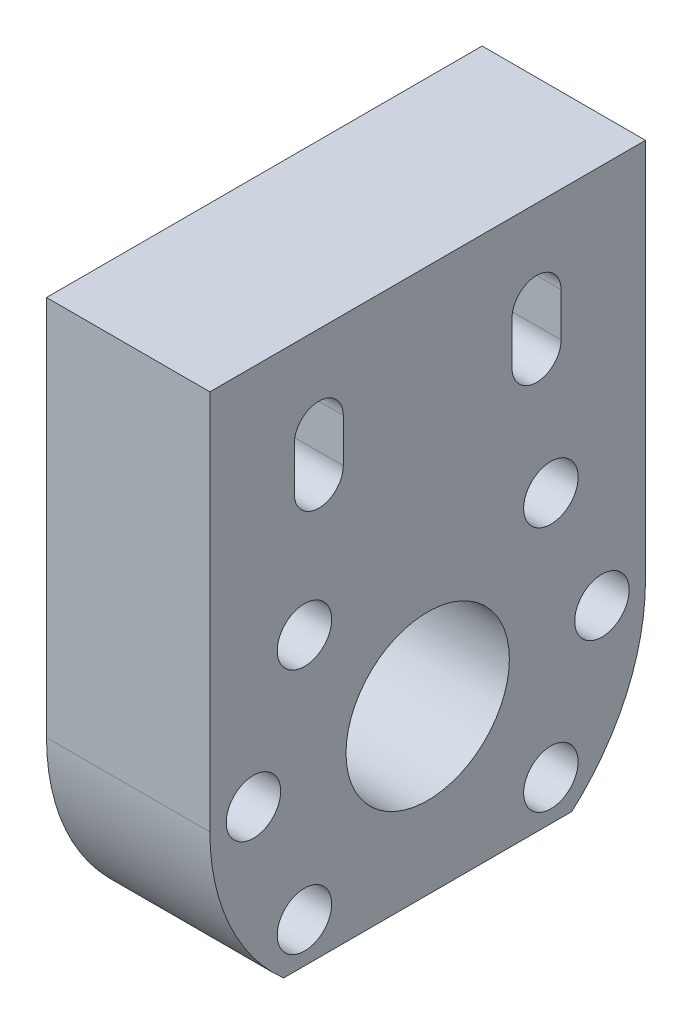
ISO-10303-21;
HEADER;
FILE_DESCRIPTION(('STEP AP214'),'2;1');
FILE_NAME('part.step','',(''),(''),'','','');
FILE_SCHEMA(('AUTOMOTIVE_DESIGN { 1 0 10303 214 1 1 1 1 }'));
ENDSEC;
DATA;
#1=APPLICATION_CONTEXT('core data for automotive mechanical design processes');
#2=APPLICATION_PROTOCOL_DEFINITION('international standard','automotive_design',2000,#1);
#3=PRODUCT_CONTEXT('',#1,'mechanical');
#4=PRODUCT('Part','Part','',(#3));
#5=PRODUCT_RELATED_PRODUCT_CATEGORY('part','',(#4));
#6=PRODUCT_DEFINITION_FORMATION('','',#4);
#7=PRODUCT_DEFINITION_CONTEXT('part definition',#1,'design');
#8=PRODUCT_DEFINITION('design','',#6,#7);
#9=PRODUCT_DEFINITION_SHAPE('','',#8);
#10=(LENGTH_UNIT() NAMED_UNIT(*) SI_UNIT(.MILLI.,.METRE.));
#11=(NAMED_UNIT(*) PLANE_ANGLE_UNIT() SI_UNIT($,.RADIAN.));
#12=(NAMED_UNIT(*) SI_UNIT($,.STERADIAN.) SOLID_ANGLE_UNIT());
#13=UNCERTAINTY_MEASURE_WITH_UNIT(LENGTH_MEASURE(1.E-05),#10,'distance_accuracy_value','');
#14=(GEOMETRIC_REPRESENTATION_CONTEXT(3) GLOBAL_UNCERTAINTY_ASSIGNED_CONTEXT((#13)) GLOBAL_UNIT_ASSIGNED_CONTEXT((#10,
#11,#12)) REPRESENTATION_CONTEXT('',''));
#15=CARTESIAN_POINT('',(0.,0.,0.));
#16=DIRECTION('',(0.,0.,1.));
#17=DIRECTION('',(1.,0.,0.));
#18=AXIS2_PLACEMENT_3D('',#15,#16,#17);
#19=CARTESIAN_POINT('',(15.,0.,0.));
#20=DIRECTION('',(-1.,0.,0.));
#21=DIRECTION('',(0.,0.,1.));
#22=AXIS2_PLACEMENT_3D('',#19,#20,#21);
#23=PLANE('',#22);
#24=CARTESIAN_POINT('',(15.,11.3137084989846,-11.3137084989849));
#25=DIRECTION('',(1.,0.,0.));
#26=DIRECTION('',(0.,0.,-1.));
#27=AXIS2_PLACEMENT_3D('',#24,#25,#26);
#28=CIRCLE('',#27,2.5);
#29=CARTESIAN_POINT('',(15.,11.3137084989846,-13.8137084989849));
#30=VERTEX_POINT('',#29);
#31=EDGE_CURVE('E174',#30,#30,#28,.T.);
#32=ORIENTED_EDGE('',*,*,#31,.F.);
#33=EDGE_LOOP('',(#32));
#34=FACE_BOUND('',#33,.T.);
#35=CARTESIAN_POINT('',(15.,11.3137084989849,11.3137084989847));
#36=DIRECTION('',(1.,0.,0.));
#37=DIRECTION('',(0.,0.,-1.));
#38=AXIS2_PLACEMENT_3D('',#35,#36,#37);
#39=CIRCLE('',#38,2.5);
#40=CARTESIAN_POINT('',(15.,11.3137084989849,8.81370849898466));
#41=VERTEX_POINT('',#40);
#42=EDGE_CURVE('E180',#41,#41,#39,.T.);
#43=ORIENTED_EDGE('',*,*,#42,.F.);
#44=EDGE_LOOP('',(#43));
#45=FACE_BOUND('',#44,.T.);
#46=CARTESIAN_POINT('',(15.,1.1172740284298E-13,16.));
#47=DIRECTION('',(1.,0.,0.));
#48=DIRECTION('',(0.,0.,-1.));
#49=AXIS2_PLACEMENT_3D('',#46,#47,#48);
#50=CIRCLE('',#49,2.5);
#51=CARTESIAN_POINT('',(15.,1.1172740284298E-13,13.5));
#52=VERTEX_POINT('',#51);
#53=EDGE_CURVE('E186',#52,#52,#50,.T.);
#54=ORIENTED_EDGE('',*,*,#53,.F.);
#55=EDGE_LOOP('',(#54));
#56=FACE_BOUND('',#55,.T.);
#57=CARTESIAN_POINT('',(15.,-11.3137084989847,11.3137084989848));
#58=DIRECTION('',(1.,0.,0.));
#59=DIRECTION('',(0.,0.,-1.));
#60=AXIS2_PLACEMENT_3D('',#57,#58,#59);
#61=CIRCLE('',#60,2.5);
#62=CARTESIAN_POINT('',(15.,-11.3137084989847,8.81370849898482));
#63=VERTEX_POINT('',#62);
#64=EDGE_CURVE('E192',#63,#63,#61,.T.);
#65=ORIENTED_EDGE('',*,*,#64,.F.);
#66=EDGE_LOOP('',(#65));
#67=FACE_BOUND('',#66,.T.);
#68=CARTESIAN_POINT('',(15.,27.,10.));
#69=DIRECTION('',(1.,0.,0.));
#70=DIRECTION('',(0.,0.,1.));
#71=AXIS2_PLACEMENT_3D('',#68,#69,#70);
#72=CIRCLE('',#71,2.25);
#73=CARTESIAN_POINT('',(15.,27.,7.75));
#74=VERTEX_POINT('',#73);
#75=CARTESIAN_POINT('',(15.,27.,12.25));
#76=VERTEX_POINT('',#75);
#77=EDGE_CURVE('E198',#74,#76,#72,.T.);
#78=ORIENTED_EDGE('',*,*,#77,.F.);
#79=DIRECTION('',(0.,1.,0.));
#80=VECTOR('',#79,1.);
#81=CARTESIAN_POINT('',(15.,23.,7.75));
#82=LINE('',#81,#80);
#83=CARTESIAN_POINT('',(15.,23.,7.75));
#84=VERTEX_POINT('',#83);
#85=EDGE_CURVE('E206',#84,#74,#82,.T.);
#86=ORIENTED_EDGE('',*,*,#85,.F.);
#87=CARTESIAN_POINT('',(15.,23.,10.));
#88=DIRECTION('',(1.,0.,0.));
#89=DIRECTION('',(0.,0.,1.));
#90=AXIS2_PLACEMENT_3D('',#87,#88,#89);
#91=CIRCLE('',#90,2.25);
#92=CARTESIAN_POINT('',(15.,23.,12.25));
#93=VERTEX_POINT('',#92);
#94=EDGE_CURVE('E203',#93,#84,#91,.T.);
#95=ORIENTED_EDGE('',*,*,#94,.F.);
#96=DIRECTION('',(0.,-1.,0.));
#97=VECTOR('',#96,1.);
#98=CARTESIAN_POINT('',(15.,23.,12.25));
#99=LINE('',#98,#97);
#100=EDGE_CURVE('E200',#76,#93,#99,.T.);
#101=ORIENTED_EDGE('',*,*,#100,.F.);
#102=EDGE_LOOP('',(#78,#86,#95,#101));
#103=FACE_BOUND('',#102,.T.);
#104=CARTESIAN_POINT('',(15.,0.,0.));
#105=DIRECTION('',(1.,0.,0.));
#106=DIRECTION('',(0.,0.,1.));
#107=AXIS2_PLACEMENT_3D('',#104,#105,#106);
#108=CIRCLE('',#107,20.);
#109=CARTESIAN_POINT('',(15.,1.4210854715202E-13,20.));
#110=VERTEX_POINT('',#109);
#111=CARTESIAN_POINT('',(15.,-15.,13.228756555323));
#112=VERTEX_POINT('',#111);
#113=EDGE_CURVE('E247',#110,#112,#108,.T.);
#114=ORIENTED_EDGE('',*,*,#113,.T.);
#115=DIRECTION('',(0.,0.,-1.));
#116=VECTOR('',#115,1.);
#117=CARTESIAN_POINT('',(15.,-15.,13.228756555323));
#118=LINE('',#117,#116);
#119=CARTESIAN_POINT('',(15.,-15.,-13.228756555323));
#120=VERTEX_POINT('',#119);
#121=EDGE_CURVE('E250',#112,#120,#118,.T.);
#122=ORIENTED_EDGE('',*,*,#121,.T.);
#123=CARTESIAN_POINT('',(15.,0.,0.));
#124=DIRECTION('',(1.,0.,0.));
#125=DIRECTION('',(0.,0.,1.));
#126=AXIS2_PLACEMENT_3D('',#123,#124,#125);
#127=CIRCLE('',#126,20.);
#128=CARTESIAN_POINT('',(15.,1.4210854715202E-13,-20.));
#129=VERTEX_POINT('',#128);
#130=EDGE_CURVE('E253',#120,#129,#127,.T.);
#131=ORIENTED_EDGE('',*,*,#130,.T.);
#132=DIRECTION('',(0.,1.,0.));
#133=VECTOR('',#132,1.);
#134=CARTESIAN_POINT('',(15.,1.4210854715202E-13,-20.));
#135=LINE('',#134,#133);
#136=CARTESIAN_POINT('',(15.,35.,-20.));
#137=VERTEX_POINT('',#136);
#138=EDGE_CURVE('E255',#129,#137,#135,.T.);
#139=ORIENTED_EDGE('',*,*,#138,.T.);
#140=DIRECTION('',(0.,0.,1.));
#141=VECTOR('',#140,1.);
#142=CARTESIAN_POINT('',(15.,35.,20.));
#143=LINE('',#142,#141);
#144=CARTESIAN_POINT('',(15.,35.,20.));
#145=VERTEX_POINT('',#144);
#146=EDGE_CURVE('E257',#137,#145,#143,.T.);
#147=ORIENTED_EDGE('',*,*,#146,.T.);
#148=DIRECTION('',(0.,-1.,0.));
#149=VECTOR('',#148,1.);
#150=CARTESIAN_POINT('',(15.,1.4210854715202E-13,20.));
#151=LINE('',#150,#149);
#152=EDGE_CURVE('E259',#145,#110,#151,.T.);
#153=ORIENTED_EDGE('',*,*,#152,.T.);
#154=EDGE_LOOP('',(#114,#122,#131,#139,#147,#153));
#155=FACE_BOUND('',#154,.T.);
#156=CARTESIAN_POINT('',(15.,0.,0.));
#157=DIRECTION('',(1.,0.,0.));
#158=DIRECTION('',(0.,0.,-1.));
#159=AXIS2_PLACEMENT_3D('',#156,#157,#158);
#160=CIRCLE('',#159,7.5);
#161=CARTESIAN_POINT('',(15.,0.,-7.5));
#162=VERTEX_POINT('',#161);
#163=EDGE_CURVE('E241',#162,#162,#160,.T.);
#164=ORIENTED_EDGE('',*,*,#163,.F.);
#165=EDGE_LOOP('',(#164));
#166=FACE_BOUND('',#165,.T.);
#167=CARTESIAN_POINT('',(15.,0.,-16.));
#168=DIRECTION('',(1.,0.,0.));
#169=DIRECTION('',(0.,0.,-1.));
#170=AXIS2_PLACEMENT_3D('',#167,#168,#169);
#171=CIRCLE('',#170,2.5);
#172=CARTESIAN_POINT('',(15.,0.,-18.5));
#173=VERTEX_POINT('',#172);
#174=EDGE_CURVE('E235',#173,#173,#171,.T.);
#175=ORIENTED_EDGE('',*,*,#174,.F.);
#176=EDGE_LOOP('',(#175));
#177=FACE_BOUND('',#176,.T.);
#178=CARTESIAN_POINT('',(15.,-11.3137084989848,-11.3137084989847));
#179=DIRECTION('',(1.,0.,0.));
#180=DIRECTION('',(0.,0.,-1.));
#181=AXIS2_PLACEMENT_3D('',#178,#179,#180);
#182=CIRCLE('',#181,2.5);
#183=CARTESIAN_POINT('',(15.,-11.3137084989848,-13.8137084989847));
#184=VERTEX_POINT('',#183);
#185=EDGE_CURVE('E229',#184,#184,#182,.T.);
#186=ORIENTED_EDGE('',*,*,#185,.F.);
#187=EDGE_LOOP('',(#186));
#188=FACE_BOUND('',#187,.T.);
#189=CARTESIAN_POINT('',(15.,27.,-10.));
#190=DIRECTION('',(1.,0.,0.));
#191=DIRECTION('',(0.,0.,-1.));
#192=AXIS2_PLACEMENT_3D('',#189,#190,#191);
#193=CIRCLE('',#192,2.25);
#194=CARTESIAN_POINT('',(15.,27.,-12.25));
#195=VERTEX_POINT('',#194);
#196=CARTESIAN_POINT('',(15.,27.,-7.75));
#197=VERTEX_POINT('',#196);
#198=EDGE_CURVE('E138',#195,#197,#193,.T.);
#199=ORIENTED_EDGE('',*,*,#198,.F.);
#200=DIRECTION('',(0.,1.,0.));
#201=VECTOR('',#200,1.);
#202=CARTESIAN_POINT('',(15.,23.,-12.25));
#203=LINE('',#202,#201);
#204=CARTESIAN_POINT('',(15.,23.,-12.25));
#205=VERTEX_POINT('',#204);
#206=EDGE_CURVE('E160',#205,#195,#203,.T.);
#207=ORIENTED_EDGE('',*,*,#206,.F.);
#208=CARTESIAN_POINT('',(15.,23.,-10.));
#209=DIRECTION('',(1.,0.,0.));
#210=DIRECTION('',(0.,0.,-1.));
#211=AXIS2_PLACEMENT_3D('',#208,#209,#210);
#212=CIRCLE('',#211,2.25);
#213=CARTESIAN_POINT('',(15.,23.,-7.75));
#214=VERTEX_POINT('',#213);
#215=EDGE_CURVE('E158',#214,#205,#212,.T.);
#216=ORIENTED_EDGE('',*,*,#215,.F.);
#217=DIRECTION('',(0.,-1.,0.));
#218=VECTOR('',#217,1.);
#219=CARTESIAN_POINT('',(15.,23.,-7.75));
#220=LINE('',#219,#218);
#221=EDGE_CURVE('E146',#197,#214,#220,.T.);
#222=ORIENTED_EDGE('',*,*,#221,.F.);
#223=EDGE_LOOP('',(#199,#207,#216,#222));
#224=FACE_BOUND('',#223,.T.);
#225=ADVANCED_FACE('F37',(#34,#45,#56,#67,#103,#155,#166,#177,#188,#224),#23,.F.);
#226=CARTESIAN_POINT('',(0.,0.,0.));
#227=DIRECTION('',(-1.,0.,0.));
#228=DIRECTION('',(0.,0.,1.));
#229=AXIS2_PLACEMENT_3D('',#226,#227,#228);
#230=PLANE('',#229);
#231=CARTESIAN_POINT('',(0.,11.3137084989849,11.3137084989847));
#232=DIRECTION('',(1.,0.,0.));
#233=DIRECTION('',(0.,0.,-1.));
#234=AXIS2_PLACEMENT_3D('',#231,#232,#233);
#235=CIRCLE('',#234,2.5);
#236=CARTESIAN_POINT('',(0.,11.3137084989849,8.81370849898466));
#237=VERTEX_POINT('',#236);
#238=EDGE_CURVE('E177',#237,#237,#235,.T.);
#239=ORIENTED_EDGE('',*,*,#238,.T.);
#240=EDGE_LOOP('',(#239));
#241=FACE_BOUND('',#240,.T.);
#242=CARTESIAN_POINT('',(0.,-11.3137084989847,11.3137084989848));
#243=DIRECTION('',(1.,0.,0.));
#244=DIRECTION('',(0.,0.,-1.));
#245=AXIS2_PLACEMENT_3D('',#242,#243,#244);
#246=CIRCLE('',#245,2.5);
#247=CARTESIAN_POINT('',(0.,-11.3137084989847,8.81370849898482));
#248=VERTEX_POINT('',#247);
#249=EDGE_CURVE('E189',#248,#248,#246,.T.);
#250=ORIENTED_EDGE('',*,*,#249,.T.);
#251=EDGE_LOOP('',(#250));
#252=FACE_BOUND('',#251,.T.);
#253=CARTESIAN_POINT('',(0.,0.,-16.));
#254=DIRECTION('',(1.,0.,0.));
#255=DIRECTION('',(0.,0.,-1.));
#256=AXIS2_PLACEMENT_3D('',#253,#254,#255);
#257=CIRCLE('',#256,2.5);
#258=CARTESIAN_POINT('',(0.,0.,-18.5));
#259=VERTEX_POINT('',#258);
#260=EDGE_CURVE('E232',#259,#259,#257,.T.);
#261=ORIENTED_EDGE('',*,*,#260,.T.);
#262=EDGE_LOOP('',(#261));
#263=FACE_BOUND('',#262,.T.);
#264=CARTESIAN_POINT('',(0.,0.,0.));
#265=DIRECTION('',(1.,0.,0.));
#266=DIRECTION('',(0.,0.,1.));
#267=AXIS2_PLACEMENT_3D('',#264,#265,#266);
#268=CIRCLE('',#267,20.);
#269=CARTESIAN_POINT('',(0.,1.4210854715202E-13,20.));
#270=VERTEX_POINT('',#269);
#271=CARTESIAN_POINT('',(0.,-15.,13.228756555323));
#272=VERTEX_POINT('',#271);
#273=EDGE_CURVE('E244',#270,#272,#268,.T.);
#274=ORIENTED_EDGE('',*,*,#273,.F.);
#275=DIRECTION('',(0.,-1.,0.));
#276=VECTOR('',#275,1.);
#277=CARTESIAN_POINT('',(0.,1.4210854715202E-13,20.));
#278=LINE('',#277,#276);
#279=CARTESIAN_POINT('',(0.,35.,20.));
#280=VERTEX_POINT('',#279);
#281=EDGE_CURVE('E251',#280,#270,#278,.T.);
#282=ORIENTED_EDGE('',*,*,#281,.F.);
#283=DIRECTION('',(0.,0.,1.));
#284=VECTOR('',#283,1.);
#285=CARTESIAN_POINT('',(0.,35.,20.));
#286=LINE('',#285,#284);
#287=CARTESIAN_POINT('',(0.,35.,-20.));
#288=VERTEX_POINT('',#287);
#289=EDGE_CURVE('E270',#288,#280,#286,.T.);
#290=ORIENTED_EDGE('',*,*,#289,.F.);
#291=DIRECTION('',(0.,1.,0.));
#292=VECTOR('',#291,1.);
#293=CARTESIAN_POINT('',(0.,1.4210854715202E-13,-20.));
#294=LINE('',#293,#292);
#295=CARTESIAN_POINT('',(0.,1.4210854715202E-13,-20.));
#296=VERTEX_POINT('',#295);
#297=EDGE_CURVE('E268',#296,#288,#294,.T.);
#298=ORIENTED_EDGE('',*,*,#297,.F.);
#299=CARTESIAN_POINT('',(0.,0.,0.));
#300=DIRECTION('',(1.,0.,0.));
#301=DIRECTION('',(0.,0.,1.));
#302=AXIS2_PLACEMENT_3D('',#299,#300,#301);
#303=CIRCLE('',#302,20.);
#304=CARTESIAN_POINT('',(0.,-15.,-13.228756555323));
#305=VERTEX_POINT('',#304);
#306=EDGE_CURVE('E266',#305,#296,#303,.T.);
#307=ORIENTED_EDGE('',*,*,#306,.F.);
#308=DIRECTION('',(0.,0.,-1.));
#309=VECTOR('',#308,1.);
#310=CARTESIAN_POINT('',(0.,-15.,13.228756555323));
#311=LINE('',#310,#309);
#312=EDGE_CURVE('E264',#272,#305,#311,.T.);
#313=ORIENTED_EDGE('',*,*,#312,.F.);
#314=EDGE_LOOP('',(#274,#282,#290,#298,#307,#313));
#315=FACE_BOUND('',#314,.T.);
#316=CARTESIAN_POINT('',(0.,0.,0.));
#317=DIRECTION('',(1.,0.,0.));
#318=DIRECTION('',(0.,0.,-1.));
#319=AXIS2_PLACEMENT_3D('',#316,#317,#318);
#320=CIRCLE('',#319,7.5);
#321=CARTESIAN_POINT('',(0.,0.,-7.5));
#322=VERTEX_POINT('',#321);
#323=EDGE_CURVE('E238',#322,#322,#320,.T.);
#324=ORIENTED_EDGE('',*,*,#323,.T.);
#325=EDGE_LOOP('',(#324));
#326=FACE_BOUND('',#325,.T.);
#327=CARTESIAN_POINT('',(0.,-11.3137084989848,-11.3137084989847));
#328=DIRECTION('',(1.,0.,0.));
#329=DIRECTION('',(0.,0.,-1.));
#330=AXIS2_PLACEMENT_3D('',#327,#328,#329);
#331=CIRCLE('',#330,2.5);
#332=CARTESIAN_POINT('',(0.,-11.3137084989848,-13.8137084989847));
#333=VERTEX_POINT('',#332);
#334=EDGE_CURVE('E228',#333,#333,#331,.T.);
#335=ORIENTED_EDGE('',*,*,#334,.T.);
#336=EDGE_LOOP('',(#335));
#337=FACE_BOUND('',#336,.T.);
#338=DIRECTION('',(0.,1.,0.));
#339=VECTOR('',#338,1.);
#340=CARTESIAN_POINT('',(0.,23.,7.75));
#341=LINE('',#340,#339);
#342=CARTESIAN_POINT('',(0.,23.,7.75));
#343=VERTEX_POINT('',#342);
#344=CARTESIAN_POINT('',(0.,27.,7.75));
#345=VERTEX_POINT('',#344);
#346=EDGE_CURVE('E201',#343,#345,#341,.T.);
#347=ORIENTED_EDGE('',*,*,#346,.T.);
#348=CARTESIAN_POINT('',(0.,27.,10.));
#349=DIRECTION('',(1.,0.,0.));
#350=DIRECTION('',(0.,0.,1.));
#351=AXIS2_PLACEMENT_3D('',#348,#349,#350);
#352=CIRCLE('',#351,2.25);
#353=CARTESIAN_POINT('',(0.,27.,12.25));
#354=VERTEX_POINT('',#353);
#355=EDGE_CURVE('E195',#345,#354,#352,.T.);
#356=ORIENTED_EDGE('',*,*,#355,.T.);
#357=DIRECTION('',(0.,-1.,0.));
#358=VECTOR('',#357,1.);
#359=CARTESIAN_POINT('',(0.,23.,12.25));
#360=LINE('',#359,#358);
#361=CARTESIAN_POINT('',(0.,23.,12.25));
#362=VERTEX_POINT('',#361);
#363=EDGE_CURVE('E211',#354,#362,#360,.T.);
#364=ORIENTED_EDGE('',*,*,#363,.T.);
#365=CARTESIAN_POINT('',(0.,23.,10.));
#366=DIRECTION('',(1.,0.,0.));
#367=DIRECTION('',(0.,0.,1.));
#368=AXIS2_PLACEMENT_3D('',#365,#366,#367);
#369=CIRCLE('',#368,2.25);
#370=EDGE_CURVE('E214',#362,#343,#369,.T.);
#371=ORIENTED_EDGE('',*,*,#370,.T.);
#372=EDGE_LOOP('',(#347,#356,#364,#371));
#373=FACE_BOUND('',#372,.T.);
#374=CARTESIAN_POINT('',(0.,1.1172740284298E-13,16.));
#375=DIRECTION('',(1.,0.,0.));
#376=DIRECTION('',(0.,0.,-1.));
#377=AXIS2_PLACEMENT_3D('',#374,#375,#376);
#378=CIRCLE('',#377,2.5);
#379=CARTESIAN_POINT('',(0.,1.1172740284298E-13,13.5));
#380=VERTEX_POINT('',#379);
#381=EDGE_CURVE('E183',#380,#380,#378,.T.);
#382=ORIENTED_EDGE('',*,*,#381,.T.);
#383=EDGE_LOOP('',(#382));
#384=FACE_BOUND('',#383,.T.);
#385=CARTESIAN_POINT('',(0.,11.3137084989846,-11.3137084989849));
#386=DIRECTION('',(1.,0.,0.));
#387=DIRECTION('',(0.,0.,-1.));
#388=AXIS2_PLACEMENT_3D('',#385,#386,#387);
#389=CIRCLE('',#388,2.5);
#390=CARTESIAN_POINT('',(0.,11.3137084989846,-13.8137084989849));
#391=VERTEX_POINT('',#390);
#392=EDGE_CURVE('E154',#391,#391,#389,.T.);
#393=ORIENTED_EDGE('',*,*,#392,.T.);
#394=EDGE_LOOP('',(#393));
#395=FACE_BOUND('',#394,.T.);
#396=DIRECTION('',(0.,1.,0.));
#397=VECTOR('',#396,1.);
#398=CARTESIAN_POINT('',(0.,23.,-12.25));
#399=LINE('',#398,#397);
#400=CARTESIAN_POINT('',(0.,23.,-12.25));
#401=VERTEX_POINT('',#400);
#402=CARTESIAN_POINT('',(0.,27.,-12.25));
#403=VERTEX_POINT('',#402);
#404=EDGE_CURVE('E147',#401,#403,#399,.T.);
#405=ORIENTED_EDGE('',*,*,#404,.T.);
#406=CARTESIAN_POINT('',(0.,27.,-10.));
#407=DIRECTION('',(1.,0.,0.));
#408=DIRECTION('',(0.,0.,-1.));
#409=AXIS2_PLACEMENT_3D('',#406,#407,#408);
#410=CIRCLE('',#409,2.25);
#411=CARTESIAN_POINT('',(0.,27.,-7.75));
#412=VERTEX_POINT('',#411);
#413=EDGE_CURVE('E60',#403,#412,#410,.T.);
#414=ORIENTED_EDGE('',*,*,#413,.T.);
#415=DIRECTION('',(0.,-1.,0.));
#416=VECTOR('',#415,1.);
#417=CARTESIAN_POINT('',(0.,23.,-7.75));
#418=LINE('',#417,#416);
#419=CARTESIAN_POINT('',(0.,23.,-7.75));
#420=VERTEX_POINT('',#419);
#421=EDGE_CURVE('E153',#412,#420,#418,.T.);
#422=ORIENTED_EDGE('',*,*,#421,.T.);
#423=CARTESIAN_POINT('',(0.,23.,-10.));
#424=DIRECTION('',(1.,0.,0.));
#425=DIRECTION('',(0.,0.,-1.));
#426=AXIS2_PLACEMENT_3D('',#423,#424,#425);
#427=CIRCLE('',#426,2.25);
#428=EDGE_CURVE('E166',#420,#401,#427,.T.);
#429=ORIENTED_EDGE('',*,*,#428,.T.);
#430=EDGE_LOOP('',(#405,#414,#422,#429));
#431=FACE_BOUND('',#430,.T.);
#432=ADVANCED_FACE('F294',(#241,#252,#263,#315,#326,#337,#373,#384,#395,#431),#230,.T.);
#433=CARTESIAN_POINT('',(15.,0.,0.));
#434=DIRECTION('',(-1.,0.,0.));
#435=DIRECTION('',(0.,0.,1.));
#436=AXIS2_PLACEMENT_3D('',#433,#434,#435);
#437=CYLINDRICAL_SURFACE('',#436,20.);
#438=ORIENTED_EDGE('',*,*,#273,.T.);
#439=DIRECTION('',(-1.,0.,0.));
#440=VECTOR('',#439,1.);
#441=CARTESIAN_POINT('',(15.,-15.,13.228756555323));
#442=LINE('',#441,#440);
#443=EDGE_CURVE('E11',#112,#272,#442,.T.);
#444=ORIENTED_EDGE('',*,*,#443,.F.);
#445=ORIENTED_EDGE('',*,*,#113,.F.);
#446=DIRECTION('',(-1.,0.,0.));
#447=VECTOR('',#446,1.);
#448=CARTESIAN_POINT('',(15.,1.4210854715202E-13,20.));
#449=LINE('',#448,#447);
#450=EDGE_CURVE('E261',#110,#270,#449,.T.);
#451=ORIENTED_EDGE('',*,*,#450,.T.);
#452=EDGE_LOOP('',(#438,#444,#445,#451));
#453=FACE_BOUND('',#452,.T.);
#454=ADVANCED_FACE('F39',(#453),#437,.T.);
#455=CARTESIAN_POINT('',(15.,-15.,13.228756555323));
#456=DIRECTION('',(0.,1.,0.));
#457=DIRECTION('',(0.,0.,1.));
#458=AXIS2_PLACEMENT_3D('',#455,#456,#457);
#459=PLANE('',#458);
#460=ORIENTED_EDGE('',*,*,#312,.T.);
#461=DIRECTION('',(-1.,0.,0.));
#462=VECTOR('',#461,1.);
#463=CARTESIAN_POINT('',(15.,-15.,-13.228756555323));
#464=LINE('',#463,#462);
#465=EDGE_CURVE('E45',#120,#305,#464,.T.);
#466=ORIENTED_EDGE('',*,*,#465,.F.);
#467=ORIENTED_EDGE('',*,*,#121,.F.);
#468=ORIENTED_EDGE('',*,*,#443,.T.);
#469=EDGE_LOOP('',(#460,#466,#467,#468));
#470=FACE_BOUND('',#469,.T.);
#471=ADVANCED_FACE('F312',(#470),#459,.F.);
#472=CARTESIAN_POINT('',(15.,0.,0.));
#473=DIRECTION('',(-1.,0.,0.));
#474=DIRECTION('',(0.,0.,1.));
#475=AXIS2_PLACEMENT_3D('',#472,#473,#474);
#476=CYLINDRICAL_SURFACE('',#475,20.);
#477=ORIENTED_EDGE('',*,*,#306,.T.);
#478=DIRECTION('',(-1.,0.,0.));
#479=VECTOR('',#478,1.);
#480=CARTESIAN_POINT('',(15.,1.4210854715202E-13,-20.));
#481=LINE('',#480,#479);
#482=EDGE_CURVE('E281',#129,#296,#481,.T.);
#483=ORIENTED_EDGE('',*,*,#482,.F.);
#484=ORIENTED_EDGE('',*,*,#130,.F.);
#485=ORIENTED_EDGE('',*,*,#465,.T.);
#486=EDGE_LOOP('',(#477,#483,#484,#485));
#487=FACE_BOUND('',#486,.T.);
#488=ADVANCED_FACE('F288',(#487),#476,.T.);
#489=CARTESIAN_POINT('',(15.,1.4210854715202E-13,-20.));
#490=DIRECTION('',(0.,0.,1.));
#491=DIRECTION('',(1.,0.,0.));
#492=AXIS2_PLACEMENT_3D('',#489,#490,#491);
#493=PLANE('',#492);
#494=ORIENTED_EDGE('',*,*,#297,.T.);
#495=DIRECTION('',(-1.,0.,0.));
#496=VECTOR('',#495,1.);
#497=CARTESIAN_POINT('',(15.,35.,-20.));
#498=LINE('',#497,#496);
#499=EDGE_CURVE('E278',#137,#288,#498,.T.);
#500=ORIENTED_EDGE('',*,*,#499,.F.);
#501=ORIENTED_EDGE('',*,*,#138,.F.);
#502=ORIENTED_EDGE('',*,*,#482,.T.);
#503=EDGE_LOOP('',(#494,#500,#501,#502));
#504=FACE_BOUND('',#503,.T.);
#505=ADVANCED_FACE('F300',(#504),#493,.F.);
#506=CARTESIAN_POINT('',(15.,35.,20.));
#507=DIRECTION('',(0.,-1.,0.));
#508=DIRECTION('',(0.,0.,-1.));
#509=AXIS2_PLACEMENT_3D('',#506,#507,#508);
#510=PLANE('',#509);
#511=ORIENTED_EDGE('',*,*,#289,.T.);
#512=DIRECTION('',(-1.,0.,0.));
#513=VECTOR('',#512,1.);
#514=CARTESIAN_POINT('',(15.,35.,20.));
#515=LINE('',#514,#513);
#516=EDGE_CURVE('E275',#145,#280,#515,.T.);
#517=ORIENTED_EDGE('',*,*,#516,.F.);
#518=ORIENTED_EDGE('',*,*,#146,.F.);
#519=ORIENTED_EDGE('',*,*,#499,.T.);
#520=EDGE_LOOP('',(#511,#517,#518,#519));
#521=FACE_BOUND('',#520,.T.);
#522=ADVANCED_FACE('F304',(#521),#510,.F.);
#523=CARTESIAN_POINT('',(15.,1.4210854715202E-13,20.));
#524=DIRECTION('',(0.,0.,-1.));
#525=DIRECTION('',(-1.,0.,0.));
#526=AXIS2_PLACEMENT_3D('',#523,#524,#525);
#527=PLANE('',#526);
#528=ORIENTED_EDGE('',*,*,#281,.T.);
#529=ORIENTED_EDGE('',*,*,#450,.F.);
#530=ORIENTED_EDGE('',*,*,#152,.F.);
#531=ORIENTED_EDGE('',*,*,#516,.T.);
#532=EDGE_LOOP('',(#528,#529,#530,#531));
#533=FACE_BOUND('',#532,.T.);
#534=ADVANCED_FACE('F315',(#533),#527,.F.);
#535=CARTESIAN_POINT('',(15.,0.,0.));
#536=DIRECTION('',(-1.,0.,0.));
#537=DIRECTION('',(0.,0.,1.));
#538=AXIS2_PLACEMENT_3D('',#535,#536,#537);
#539=CYLINDRICAL_SURFACE('',#538,7.5);
#540=ORIENTED_EDGE('',*,*,#163,.T.);
#541=EDGE_LOOP('',(#540));
#542=FACE_BOUND('',#541,.T.);
#543=ORIENTED_EDGE('',*,*,#323,.F.);
#544=EDGE_LOOP('',(#543));
#545=FACE_BOUND('',#544,.T.);
#546=ADVANCED_FACE('F317',(#542,#545),#539,.F.);
#547=CARTESIAN_POINT('',(15.,0.,-16.));
#548=DIRECTION('',(-1.,0.,0.));
#549=DIRECTION('',(0.,0.,1.));
#550=AXIS2_PLACEMENT_3D('',#547,#548,#549);
#551=CYLINDRICAL_SURFACE('',#550,2.5);
#552=ORIENTED_EDGE('',*,*,#174,.T.);
#553=EDGE_LOOP('',(#552));
#554=FACE_BOUND('',#553,.T.);
#555=ORIENTED_EDGE('',*,*,#260,.F.);
#556=EDGE_LOOP('',(#555));
#557=FACE_BOUND('',#556,.T.);
#558=ADVANCED_FACE('F323',(#554,#557),#551,.F.);
#559=CARTESIAN_POINT('',(15.,-11.3137084989848,-11.3137084989847));
#560=DIRECTION('',(-1.,0.,0.));
#561=DIRECTION('',(0.,0.,1.));
#562=AXIS2_PLACEMENT_3D('',#559,#560,#561);
#563=CYLINDRICAL_SURFACE('',#562,2.5);
#564=ORIENTED_EDGE('',*,*,#185,.T.);
#565=EDGE_LOOP('',(#564));
#566=FACE_BOUND('',#565,.T.);
#567=ORIENTED_EDGE('',*,*,#334,.F.);
#568=EDGE_LOOP('',(#567));
#569=FACE_BOUND('',#568,.T.);
#570=ADVANCED_FACE('F340',(#566,#569),#563,.F.);
#571=CARTESIAN_POINT('',(15.,27.,10.));
#572=DIRECTION('',(-1.,0.,0.));
#573=DIRECTION('',(0.,0.,1.));
#574=AXIS2_PLACEMENT_3D('',#571,#572,#573);
#575=CYLINDRICAL_SURFACE('',#574,2.25);
#576=ORIENTED_EDGE('',*,*,#355,.F.);
#577=DIRECTION('',(-1.,0.,0.));
#578=VECTOR('',#577,1.);
#579=CARTESIAN_POINT('',(15.,27.,7.75));
#580=LINE('',#579,#578);
#581=EDGE_CURVE('E208',#74,#345,#580,.T.);
#582=ORIENTED_EDGE('',*,*,#581,.F.);
#583=ORIENTED_EDGE('',*,*,#77,.T.);
#584=DIRECTION('',(-1.,0.,0.));
#585=VECTOR('',#584,1.);
#586=CARTESIAN_POINT('',(15.,27.,12.25));
#587=LINE('',#586,#585);
#588=EDGE_CURVE('E225',#76,#354,#587,.T.);
#589=ORIENTED_EDGE('',*,*,#588,.T.);
#590=EDGE_LOOP('',(#576,#582,#583,#589));
#591=FACE_BOUND('',#590,.T.);
#592=ADVANCED_FACE('F344',(#591),#575,.F.);
#593=CARTESIAN_POINT('',(15.,23.,12.25));
#594=DIRECTION('',(0.,0.,-1.));
#595=DIRECTION('',(-1.,0.,0.));
#596=AXIS2_PLACEMENT_3D('',#593,#594,#595);
#597=PLANE('',#596);
#598=ORIENTED_EDGE('',*,*,#363,.F.);
#599=ORIENTED_EDGE('',*,*,#588,.F.);
#600=ORIENTED_EDGE('',*,*,#100,.T.);
#601=DIRECTION('',(-1.,0.,0.));
#602=VECTOR('',#601,1.);
#603=CARTESIAN_POINT('',(15.,23.,12.25));
#604=LINE('',#603,#602);
#605=EDGE_CURVE('E223',#93,#362,#604,.T.);
#606=ORIENTED_EDGE('',*,*,#605,.T.);
#607=EDGE_LOOP('',(#598,#599,#600,#606));
#608=FACE_BOUND('',#607,.T.);
#609=ADVANCED_FACE('F348',(#608),#597,.T.);
#610=CARTESIAN_POINT('',(15.,23.,10.));
#611=DIRECTION('',(-1.,0.,0.));
#612=DIRECTION('',(0.,0.,1.));
#613=AXIS2_PLACEMENT_3D('',#610,#611,#612);
#614=CYLINDRICAL_SURFACE('',#613,2.25);
#615=ORIENTED_EDGE('',*,*,#370,.F.);
#616=ORIENTED_EDGE('',*,*,#605,.F.);
#617=ORIENTED_EDGE('',*,*,#94,.T.);
#618=DIRECTION('',(-1.,0.,0.));
#619=VECTOR('',#618,1.);
#620=CARTESIAN_POINT('',(15.,23.,7.75));
#621=LINE('',#620,#619);
#622=EDGE_CURVE('E221',#84,#343,#621,.T.);
#623=ORIENTED_EDGE('',*,*,#622,.T.);
#624=EDGE_LOOP('',(#615,#616,#617,#623));
#625=FACE_BOUND('',#624,.T.);
#626=ADVANCED_FACE('F352',(#625),#614,.F.);
#627=CARTESIAN_POINT('',(15.,23.,7.75));
#628=DIRECTION('',(0.,0.,1.));
#629=DIRECTION('',(1.,0.,0.));
#630=AXIS2_PLACEMENT_3D('',#627,#628,#629);
#631=PLANE('',#630);
#632=ORIENTED_EDGE('',*,*,#346,.F.);
#633=ORIENTED_EDGE('',*,*,#622,.F.);
#634=ORIENTED_EDGE('',*,*,#85,.T.);
#635=ORIENTED_EDGE('',*,*,#581,.T.);
#636=EDGE_LOOP('',(#632,#633,#634,#635));
#637=FACE_BOUND('',#636,.T.);
#638=ADVANCED_FACE('F356',(#637),#631,.T.);
#639=CARTESIAN_POINT('',(15.,-11.3137084989847,11.3137084989848));
#640=DIRECTION('',(-1.,0.,0.));
#641=DIRECTION('',(0.,0.,1.));
#642=AXIS2_PLACEMENT_3D('',#639,#640,#641);
#643=CYLINDRICAL_SURFACE('',#642,2.5);
#644=ORIENTED_EDGE('',*,*,#64,.T.);
#645=EDGE_LOOP('',(#644));
#646=FACE_BOUND('',#645,.T.);
#647=ORIENTED_EDGE('',*,*,#249,.F.);
#648=EDGE_LOOP('',(#647));
#649=FACE_BOUND('',#648,.T.);
#650=ADVANCED_FACE('F360',(#646,#649),#643,.F.);
#651=CARTESIAN_POINT('',(15.,1.1172740284298E-13,16.));
#652=DIRECTION('',(-1.,0.,0.));
#653=DIRECTION('',(0.,0.,1.));
#654=AXIS2_PLACEMENT_3D('',#651,#652,#653);
#655=CYLINDRICAL_SURFACE('',#654,2.5);
#656=ORIENTED_EDGE('',*,*,#53,.T.);
#657=EDGE_LOOP('',(#656));
#658=FACE_BOUND('',#657,.T.);
#659=ORIENTED_EDGE('',*,*,#381,.F.);
#660=EDGE_LOOP('',(#659));
#661=FACE_BOUND('',#660,.T.);
#662=ADVANCED_FACE('F364',(#658,#661),#655,.F.);
#663=CARTESIAN_POINT('',(15.,11.3137084989849,11.3137084989847));
#664=DIRECTION('',(-1.,0.,0.));
#665=DIRECTION('',(0.,0.,1.));
#666=AXIS2_PLACEMENT_3D('',#663,#664,#665);
#667=CYLINDRICAL_SURFACE('',#666,2.5);
#668=ORIENTED_EDGE('',*,*,#42,.T.);
#669=EDGE_LOOP('',(#668));
#670=FACE_BOUND('',#669,.T.);
#671=ORIENTED_EDGE('',*,*,#238,.F.);
#672=EDGE_LOOP('',(#671));
#673=FACE_BOUND('',#672,.T.);
#674=ADVANCED_FACE('F368',(#670,#673),#667,.F.);
#675=CARTESIAN_POINT('',(15.,11.3137084989846,-11.3137084989849));
#676=DIRECTION('',(-1.,0.,0.));
#677=DIRECTION('',(0.,0.,1.));
#678=AXIS2_PLACEMENT_3D('',#675,#676,#677);
#679=CYLINDRICAL_SURFACE('',#678,2.5);
#680=ORIENTED_EDGE('',*,*,#31,.T.);
#681=EDGE_LOOP('',(#680));
#682=FACE_BOUND('',#681,.T.);
#683=ORIENTED_EDGE('',*,*,#392,.F.);
#684=EDGE_LOOP('',(#683));
#685=FACE_BOUND('',#684,.T.);
#686=ADVANCED_FACE('F372',(#682,#685),#679,.F.);
#687=CARTESIAN_POINT('',(15.,27.,-10.));
#688=DIRECTION('',(-1.,0.,0.));
#689=DIRECTION('',(0.,0.,1.));
#690=AXIS2_PLACEMENT_3D('',#687,#688,#689);
#691=CYLINDRICAL_SURFACE('',#690,2.25);
#692=ORIENTED_EDGE('',*,*,#413,.F.);
#693=DIRECTION('',(-1.,0.,0.));
#694=VECTOR('',#693,1.);
#695=CARTESIAN_POINT('',(15.,27.,-12.25));
#696=LINE('',#695,#694);
#697=EDGE_CURVE('E142',#195,#403,#696,.T.);
#698=ORIENTED_EDGE('',*,*,#697,.F.);
#699=ORIENTED_EDGE('',*,*,#198,.T.);
#700=DIRECTION('',(-1.,0.,0.));
#701=VECTOR('',#700,1.);
#702=CARTESIAN_POINT('',(15.,27.,-7.75));
#703=LINE('',#702,#701);
#704=EDGE_CURVE('E141',#197,#412,#703,.T.);
#705=ORIENTED_EDGE('',*,*,#704,.T.);
#706=EDGE_LOOP('',(#692,#698,#699,#705));
#707=FACE_BOUND('',#706,.T.);
#708=ADVANCED_FACE('F140',(#707),#691,.F.);
#709=CARTESIAN_POINT('',(15.,23.,-7.75));
#710=DIRECTION('',(0.,0.,-1.));
#711=DIRECTION('',(-1.,0.,0.));
#712=AXIS2_PLACEMENT_3D('',#709,#710,#711);
#713=PLANE('',#712);
#714=ORIENTED_EDGE('',*,*,#421,.F.);
#715=ORIENTED_EDGE('',*,*,#704,.F.);
#716=ORIENTED_EDGE('',*,*,#221,.T.);
#717=DIRECTION('',(-1.,0.,0.));
#718=VECTOR('',#717,1.);
#719=CARTESIAN_POINT('',(15.,23.,-7.75));
#720=LINE('',#719,#718);
#721=EDGE_CURVE('E155',#214,#420,#720,.T.);
#722=ORIENTED_EDGE('',*,*,#721,.T.);
#723=EDGE_LOOP('',(#714,#715,#716,#722));
#724=FACE_BOUND('',#723,.T.);
#725=ADVANCED_FACE('F150',(#724),#713,.T.);
#726=CARTESIAN_POINT('',(15.,23.,-10.));
#727=DIRECTION('',(-1.,0.,0.));
#728=DIRECTION('',(0.,0.,1.));
#729=AXIS2_PLACEMENT_3D('',#726,#727,#728);
#730=CYLINDRICAL_SURFACE('',#729,2.25);
#731=ORIENTED_EDGE('',*,*,#428,.F.);
#732=ORIENTED_EDGE('',*,*,#721,.F.);
#733=ORIENTED_EDGE('',*,*,#215,.T.);
#734=DIRECTION('',(-1.,0.,0.));
#735=VECTOR('',#734,1.);
#736=CARTESIAN_POINT('',(15.,23.,-12.25));
#737=LINE('',#736,#735);
#738=EDGE_CURVE('E52',#205,#401,#737,.T.);
#739=ORIENTED_EDGE('',*,*,#738,.T.);
#740=EDGE_LOOP('',(#731,#732,#733,#739));
#741=FACE_BOUND('',#740,.T.);
#742=ADVANCED_FACE('F381',(#741),#730,.F.);
#743=CARTESIAN_POINT('',(15.,23.,-12.25));
#744=DIRECTION('',(0.,0.,1.));
#745=DIRECTION('',(1.,0.,0.));
#746=AXIS2_PLACEMENT_3D('',#743,#744,#745);
#747=PLANE('',#746);
#748=ORIENTED_EDGE('',*,*,#404,.F.);
#749=ORIENTED_EDGE('',*,*,#738,.F.);
#750=ORIENTED_EDGE('',*,*,#206,.T.);
#751=ORIENTED_EDGE('',*,*,#697,.T.);
#752=EDGE_LOOP('',(#748,#749,#750,#751));
#753=FACE_BOUND('',#752,.T.);
#754=ADVANCED_FACE('F384',(#753),#747,.T.);
#755=CLOSED_SHELL('',(#225,#432,#454,#471,#488,#505,#522,#534,#546,#558,#570,#592,#609,#626,
#638,#650,#662,#674,#686,#708,#725,#742,#754));
#756=MANIFOLD_SOLID_BREP('B2',#755);
#757=ADVANCED_BREP_SHAPE_REPRESENTATION('',(#18,#756),#14);
#758=SHAPE_DEFINITION_REPRESENTATION(#9,#757);
ENDSEC;
END-ISO-10303-21;
